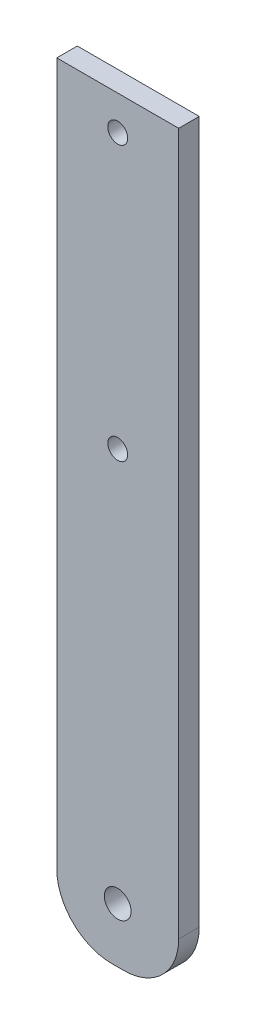
ISO-10303-21;
HEADER;
FILE_DESCRIPTION(('STEP AP214'),'2;1');
FILE_NAME('part.step','',(''),(''),'','','');
FILE_SCHEMA(('AUTOMOTIVE_DESIGN { 1 0 10303 214 1 1 1 1 }'));
ENDSEC;
DATA;
#1=APPLICATION_CONTEXT('core data for automotive mechanical design processes');
#2=APPLICATION_PROTOCOL_DEFINITION('international standard','automotive_design',2000,#1);
#3=PRODUCT_CONTEXT('',#1,'mechanical');
#4=PRODUCT('Part','Part','',(#3));
#5=PRODUCT_RELATED_PRODUCT_CATEGORY('part','',(#4));
#6=PRODUCT_DEFINITION_FORMATION('','',#4);
#7=PRODUCT_DEFINITION_CONTEXT('part definition',#1,'design');
#8=PRODUCT_DEFINITION('design','',#6,#7);
#9=PRODUCT_DEFINITION_SHAPE('','',#8);
#10=(LENGTH_UNIT() NAMED_UNIT(*) SI_UNIT(.MILLI.,.METRE.));
#11=(NAMED_UNIT(*) PLANE_ANGLE_UNIT() SI_UNIT($,.RADIAN.));
#12=(NAMED_UNIT(*) SI_UNIT($,.STERADIAN.) SOLID_ANGLE_UNIT());
#13=UNCERTAINTY_MEASURE_WITH_UNIT(LENGTH_MEASURE(1.E-05),#10,'distance_accuracy_value','');
#14=(GEOMETRIC_REPRESENTATION_CONTEXT(3) GLOBAL_UNCERTAINTY_ASSIGNED_CONTEXT((#13)) GLOBAL_UNIT_ASSIGNED_CONTEXT((#10,
#11,#12)) REPRESENTATION_CONTEXT('',''));
#15=CARTESIAN_POINT('',(0.,0.,0.));
#16=DIRECTION('',(0.,0.,1.));
#17=DIRECTION('',(1.,0.,0.));
#18=AXIS2_PLACEMENT_3D('',#15,#16,#17);
#19=CARTESIAN_POINT('',(0.,0.,3.));
#20=DIRECTION('',(0.,0.,-1.));
#21=DIRECTION('',(-1.,0.,0.));
#22=AXIS2_PLACEMENT_3D('',#19,#20,#21);
#23=PLANE('',#22);
#24=DIRECTION('',(1.,0.,0.));
#25=VECTOR('',#24,1.);
#26=CARTESIAN_POINT('',(-8.9,-8.,3.));
#27=LINE('',#26,#25);
#28=CARTESIAN_POINT('',(-0.9,-8.,3.));
#29=VERTEX_POINT('',#28);
#30=CARTESIAN_POINT('',(0.900000000000001,-8.,3.));
#31=VERTEX_POINT('',#30);
#32=EDGE_CURVE('E133',#29,#31,#27,.T.);
#33=ORIENTED_EDGE('',*,*,#32,.T.);
#34=CARTESIAN_POINT('',(0.900000000000001,0.,3.));
#35=DIRECTION('',(0.,0.,-1.));
#36=DIRECTION('',(-1.,0.,0.));
#37=AXIS2_PLACEMENT_3D('',#34,#35,#36);
#38=CIRCLE('',#37,8.);
#39=CARTESIAN_POINT('',(8.9,0.,3.));
#40=VERTEX_POINT('',#39);
#41=EDGE_CURVE('E54',#31,#40,#38,.F.);
#42=ORIENTED_EDGE('',*,*,#41,.T.);
#43=DIRECTION('',(0.,1.,0.));
#44=VECTOR('',#43,1.);
#45=CARTESIAN_POINT('',(8.9,-8.,3.));
#46=LINE('',#45,#44);
#47=CARTESIAN_POINT('',(8.9,102.5,3.));
#48=VERTEX_POINT('',#47);
#49=EDGE_CURVE('E100',#40,#48,#46,.T.);
#50=ORIENTED_EDGE('',*,*,#49,.T.);
#51=DIRECTION('',(-1.,0.,0.));
#52=VECTOR('',#51,1.);
#53=CARTESIAN_POINT('',(-8.9,102.5,3.));
#54=LINE('',#53,#52);
#55=CARTESIAN_POINT('',(-8.9,102.5,3.));
#56=VERTEX_POINT('',#55);
#57=EDGE_CURVE('E103',#48,#56,#54,.T.);
#58=ORIENTED_EDGE('',*,*,#57,.T.);
#59=DIRECTION('',(0.,-1.,0.));
#60=VECTOR('',#59,1.);
#61=CARTESIAN_POINT('',(-8.9,-8.,3.));
#62=LINE('',#61,#60);
#63=CARTESIAN_POINT('',(-8.9,0.,3.));
#64=VERTEX_POINT('',#63);
#65=EDGE_CURVE('E120',#56,#64,#62,.T.);
#66=ORIENTED_EDGE('',*,*,#65,.T.);
#67=CARTESIAN_POINT('',(-0.9,0.,3.));
#68=DIRECTION('',(0.,0.,-1.));
#69=DIRECTION('',(-1.,0.,0.));
#70=AXIS2_PLACEMENT_3D('',#67,#68,#69);
#71=CIRCLE('',#70,8.);
#72=EDGE_CURVE('E148',#64,#29,#71,.F.);
#73=ORIENTED_EDGE('',*,*,#72,.T.);
#74=EDGE_LOOP('',(#33,#42,#50,#58,#66,#73));
#75=FACE_BOUND('',#74,.T.);
#76=CARTESIAN_POINT('',(0.,0.,3.));
#77=DIRECTION('',(0.,0.,1.));
#78=DIRECTION('',(1.,0.,0.));
#79=AXIS2_PLACEMENT_3D('',#76,#77,#78);
#80=CIRCLE('',#79,1.95);
#81=CARTESIAN_POINT('',(1.95,0.,3.));
#82=VERTEX_POINT('',#81);
#83=EDGE_CURVE('E172',#82,#82,#80,.T.);
#84=ORIENTED_EDGE('',*,*,#83,.F.);
#85=EDGE_LOOP('',(#84));
#86=FACE_BOUND('',#85,.T.);
#87=CARTESIAN_POINT('',(0.,57.5,3.));
#88=DIRECTION('',(0.,0.,1.));
#89=DIRECTION('',(1.,0.,0.));
#90=AXIS2_PLACEMENT_3D('',#87,#88,#89);
#91=CIRCLE('',#90,1.45);
#92=CARTESIAN_POINT('',(1.45,57.5,3.));
#93=VERTEX_POINT('',#92);
#94=EDGE_CURVE('E180',#93,#93,#91,.T.);
#95=ORIENTED_EDGE('',*,*,#94,.F.);
#96=EDGE_LOOP('',(#95));
#97=FACE_BOUND('',#96,.T.);
#98=CARTESIAN_POINT('',(0.,97.5,3.));
#99=DIRECTION('',(0.,0.,1.));
#100=DIRECTION('',(1.,0.,0.));
#101=AXIS2_PLACEMENT_3D('',#98,#99,#100);
#102=CIRCLE('',#101,1.45);
#103=CARTESIAN_POINT('',(1.45,97.5,3.));
#104=VERTEX_POINT('',#103);
#105=EDGE_CURVE('E188',#104,#104,#102,.T.);
#106=ORIENTED_EDGE('',*,*,#105,.F.);
#107=EDGE_LOOP('',(#106));
#108=FACE_BOUND('',#107,.T.);
#109=ADVANCED_FACE('F45',(#75,#86,#97,#108),#23,.F.);
#110=CARTESIAN_POINT('',(0.,0.,0.));
#111=DIRECTION('',(0.,0.,-1.));
#112=DIRECTION('',(-1.,0.,0.));
#113=AXIS2_PLACEMENT_3D('',#110,#111,#112);
#114=PLANE('',#113);
#115=CARTESIAN_POINT('',(0.,57.5,0.));
#116=DIRECTION('',(0.,0.,1.));
#117=DIRECTION('',(1.,0.,0.));
#118=AXIS2_PLACEMENT_3D('',#115,#116,#117);
#119=CIRCLE('',#118,1.45);
#120=CARTESIAN_POINT('',(1.45,57.5,0.));
#121=VERTEX_POINT('',#120);
#122=EDGE_CURVE('E184',#121,#121,#119,.T.);
#123=ORIENTED_EDGE('',*,*,#122,.T.);
#124=EDGE_LOOP('',(#123));
#125=FACE_BOUND('',#124,.T.);
#126=DIRECTION('',(0.,1.,0.));
#127=VECTOR('',#126,1.);
#128=CARTESIAN_POINT('',(8.9,-8.,0.));
#129=LINE('',#128,#127);
#130=CARTESIAN_POINT('',(8.9,0.,0.));
#131=VERTEX_POINT('',#130);
#132=CARTESIAN_POINT('',(8.9,102.5,0.));
#133=VERTEX_POINT('',#132);
#134=EDGE_CURVE('E124',#131,#133,#129,.T.);
#135=ORIENTED_EDGE('',*,*,#134,.F.);
#136=CARTESIAN_POINT('',(0.900000000000001,0.,0.));
#137=DIRECTION('',(0.,0.,-1.));
#138=DIRECTION('',(-1.,0.,0.));
#139=AXIS2_PLACEMENT_3D('',#136,#137,#138);
#140=CIRCLE('',#139,8.);
#141=CARTESIAN_POINT('',(0.900000000000001,-8.,0.));
#142=VERTEX_POINT('',#141);
#143=EDGE_CURVE('E139',#131,#142,#140,.T.);
#144=ORIENTED_EDGE('',*,*,#143,.T.);
#145=DIRECTION('',(1.,0.,0.));
#146=VECTOR('',#145,1.);
#147=CARTESIAN_POINT('',(-8.9,-8.,0.));
#148=LINE('',#147,#146);
#149=CARTESIAN_POINT('',(-0.9,-8.,0.));
#150=VERTEX_POINT('',#149);
#151=EDGE_CURVE('E111',#150,#142,#148,.T.);
#152=ORIENTED_EDGE('',*,*,#151,.F.);
#153=CARTESIAN_POINT('',(-0.9,0.,0.));
#154=DIRECTION('',(0.,0.,-1.));
#155=DIRECTION('',(-1.,0.,0.));
#156=AXIS2_PLACEMENT_3D('',#153,#154,#155);
#157=CIRCLE('',#156,8.);
#158=CARTESIAN_POINT('',(-8.9,0.,0.));
#159=VERTEX_POINT('',#158);
#160=EDGE_CURVE('E131',#150,#159,#157,.T.);
#161=ORIENTED_EDGE('',*,*,#160,.T.);
#162=DIRECTION('',(0.,-1.,0.));
#163=VECTOR('',#162,1.);
#164=CARTESIAN_POINT('',(-8.9,-8.,0.));
#165=LINE('',#164,#163);
#166=CARTESIAN_POINT('',(-8.9,102.5,0.));
#167=VERTEX_POINT('',#166);
#168=EDGE_CURVE('E162',#167,#159,#165,.T.);
#169=ORIENTED_EDGE('',*,*,#168,.F.);
#170=DIRECTION('',(-1.,0.,0.));
#171=VECTOR('',#170,1.);
#172=CARTESIAN_POINT('',(-8.9,102.5,0.));
#173=LINE('',#172,#171);
#174=EDGE_CURVE('E165',#133,#167,#173,.T.);
#175=ORIENTED_EDGE('',*,*,#174,.F.);
#176=EDGE_LOOP('',(#135,#144,#152,#161,#169,#175));
#177=FACE_BOUND('',#176,.T.);
#178=CARTESIAN_POINT('',(0.,0.,0.));
#179=DIRECTION('',(0.,0.,1.));
#180=DIRECTION('',(1.,0.,0.));
#181=AXIS2_PLACEMENT_3D('',#178,#179,#180);
#182=CIRCLE('',#181,1.95);
#183=CARTESIAN_POINT('',(1.95,0.,0.));
#184=VERTEX_POINT('',#183);
#185=EDGE_CURVE('E176',#184,#184,#182,.T.);
#186=ORIENTED_EDGE('',*,*,#185,.T.);
#187=EDGE_LOOP('',(#186));
#188=FACE_BOUND('',#187,.T.);
#189=CARTESIAN_POINT('',(0.,97.5,0.));
#190=DIRECTION('',(0.,0.,1.));
#191=DIRECTION('',(1.,0.,0.));
#192=AXIS2_PLACEMENT_3D('',#189,#190,#191);
#193=CIRCLE('',#192,1.45);
#194=CARTESIAN_POINT('',(1.45,97.5,0.));
#195=VERTEX_POINT('',#194);
#196=EDGE_CURVE('E192',#195,#195,#193,.T.);
#197=ORIENTED_EDGE('',*,*,#196,.T.);
#198=EDGE_LOOP('',(#197));
#199=FACE_BOUND('',#198,.T.);
#200=ADVANCED_FACE('F160',(#125,#177,#188,#199),#114,.T.);
#201=CARTESIAN_POINT('',(8.9,-8.,3.));
#202=DIRECTION('',(-1.,0.,0.));
#203=DIRECTION('',(0.,-1.,0.));
#204=AXIS2_PLACEMENT_3D('',#201,#202,#203);
#205=PLANE('',#204);
#206=ORIENTED_EDGE('',*,*,#49,.F.);
#207=DIRECTION('',(0.,0.,-1.));
#208=VECTOR('',#207,1.);
#209=CARTESIAN_POINT('',(8.9,0.,3.));
#210=LINE('',#209,#208);
#211=EDGE_CURVE('E127',#40,#131,#210,.T.);
#212=ORIENTED_EDGE('',*,*,#211,.T.);
#213=ORIENTED_EDGE('',*,*,#134,.T.);
#214=DIRECTION('',(0.,0.,-1.));
#215=VECTOR('',#214,1.);
#216=CARTESIAN_POINT('',(8.9,102.5,3.));
#217=LINE('',#216,#215);
#218=EDGE_CURVE('E116',#48,#133,#217,.T.);
#219=ORIENTED_EDGE('',*,*,#218,.F.);
#220=EDGE_LOOP('',(#206,#212,#213,#219));
#221=FACE_BOUND('',#220,.T.);
#222=ADVANCED_FACE('F122',(#221),#205,.F.);
#223=CARTESIAN_POINT('',(-8.9,102.5,3.));
#224=DIRECTION('',(0.,-1.,0.));
#225=DIRECTION('',(0.,0.,-1.));
#226=AXIS2_PLACEMENT_3D('',#223,#224,#225);
#227=PLANE('',#226);
#228=ORIENTED_EDGE('',*,*,#174,.T.);
#229=DIRECTION('',(0.,0.,-1.));
#230=VECTOR('',#229,1.);
#231=CARTESIAN_POINT('',(-8.9,102.5,3.));
#232=LINE('',#231,#230);
#233=EDGE_CURVE('E118',#56,#167,#232,.T.);
#234=ORIENTED_EDGE('',*,*,#233,.F.);
#235=ORIENTED_EDGE('',*,*,#57,.F.);
#236=ORIENTED_EDGE('',*,*,#218,.T.);
#237=EDGE_LOOP('',(#228,#234,#235,#236));
#238=FACE_BOUND('',#237,.T.);
#239=ADVANCED_FACE('F115',(#238),#227,.F.);
#240=CARTESIAN_POINT('',(-8.9,-8.,3.));
#241=DIRECTION('',(1.,0.,0.));
#242=DIRECTION('',(0.,1.,0.));
#243=AXIS2_PLACEMENT_3D('',#240,#241,#242);
#244=PLANE('',#243);
#245=ORIENTED_EDGE('',*,*,#168,.T.);
#246=DIRECTION('',(0.,0.,-1.));
#247=VECTOR('',#246,1.);
#248=CARTESIAN_POINT('',(-8.9,0.,3.));
#249=LINE('',#248,#247);
#250=EDGE_CURVE('E11',#159,#64,#249,.F.);
#251=ORIENTED_EDGE('',*,*,#250,.T.);
#252=ORIENTED_EDGE('',*,*,#65,.F.);
#253=ORIENTED_EDGE('',*,*,#233,.T.);
#254=EDGE_LOOP('',(#245,#251,#252,#253));
#255=FACE_BOUND('',#254,.T.);
#256=ADVANCED_FACE('F163',(#255),#244,.F.);
#257=CARTESIAN_POINT('',(-8.9,-8.,3.));
#258=DIRECTION('',(0.,1.,0.));
#259=DIRECTION('',(0.,0.,1.));
#260=AXIS2_PLACEMENT_3D('',#257,#258,#259);
#261=PLANE('',#260);
#262=ORIENTED_EDGE('',*,*,#151,.T.);
#263=DIRECTION('',(0.,0.,-1.));
#264=VECTOR('',#263,1.);
#265=CARTESIAN_POINT('',(0.900000000000001,-8.,3.));
#266=LINE('',#265,#264);
#267=EDGE_CURVE('E67',#142,#31,#266,.F.);
#268=ORIENTED_EDGE('',*,*,#267,.T.);
#269=ORIENTED_EDGE('',*,*,#32,.F.);
#270=DIRECTION('',(0.,0.,-1.));
#271=VECTOR('',#270,1.);
#272=CARTESIAN_POINT('',(-0.9,-8.,3.));
#273=LINE('',#272,#271);
#274=EDGE_CURVE('E142',#29,#150,#273,.T.);
#275=ORIENTED_EDGE('',*,*,#274,.T.);
#276=EDGE_LOOP('',(#262,#268,#269,#275));
#277=FACE_BOUND('',#276,.T.);
#278=ADVANCED_FACE('F154',(#277),#261,.F.);
#279=CARTESIAN_POINT('',(0.,0.,3.));
#280=DIRECTION('',(0.,0.,-1.));
#281=DIRECTION('',(-1.,0.,0.));
#282=AXIS2_PLACEMENT_3D('',#279,#280,#281);
#283=CYLINDRICAL_SURFACE('',#282,1.95);
#284=ORIENTED_EDGE('',*,*,#83,.T.);
#285=EDGE_LOOP('',(#284));
#286=FACE_BOUND('',#285,.T.);
#287=ORIENTED_EDGE('',*,*,#185,.F.);
#288=EDGE_LOOP('',(#287));
#289=FACE_BOUND('',#288,.T.);
#290=ADVANCED_FACE('F212',(#286,#289),#283,.F.);
#291=CARTESIAN_POINT('',(0.,57.5,3.));
#292=DIRECTION('',(0.,0.,-1.));
#293=DIRECTION('',(-1.,0.,0.));
#294=AXIS2_PLACEMENT_3D('',#291,#292,#293);
#295=CYLINDRICAL_SURFACE('',#294,1.45);
#296=ORIENTED_EDGE('',*,*,#94,.T.);
#297=EDGE_LOOP('',(#296));
#298=FACE_BOUND('',#297,.T.);
#299=ORIENTED_EDGE('',*,*,#122,.F.);
#300=EDGE_LOOP('',(#299));
#301=FACE_BOUND('',#300,.T.);
#302=ADVANCED_FACE('F228',(#298,#301),#295,.F.);
#303=CARTESIAN_POINT('',(0.,97.5,3.));
#304=DIRECTION('',(0.,0.,-1.));
#305=DIRECTION('',(-1.,0.,0.));
#306=AXIS2_PLACEMENT_3D('',#303,#304,#305);
#307=CYLINDRICAL_SURFACE('',#306,1.45);
#308=ORIENTED_EDGE('',*,*,#105,.T.);
#309=EDGE_LOOP('',(#308));
#310=FACE_BOUND('',#309,.T.);
#311=ORIENTED_EDGE('',*,*,#196,.F.);
#312=EDGE_LOOP('',(#311));
#313=FACE_BOUND('',#312,.T.);
#314=ADVANCED_FACE('F200',(#310,#313),#307,.F.);
#315=CARTESIAN_POINT('',(0.900000000000001,0.,3.));
#316=DIRECTION('',(0.,0.,-1.));
#317=DIRECTION('',(-1.,0.,0.));
#318=AXIS2_PLACEMENT_3D('',#315,#316,#317);
#319=CYLINDRICAL_SURFACE('',#318,8.);
#320=ORIENTED_EDGE('',*,*,#41,.F.);
#321=ORIENTED_EDGE('',*,*,#267,.F.);
#322=ORIENTED_EDGE('',*,*,#143,.F.);
#323=ORIENTED_EDGE('',*,*,#211,.F.);
#324=EDGE_LOOP('',(#320,#321,#322,#323));
#325=FACE_BOUND('',#324,.T.);
#326=ADVANCED_FACE('F222',(#325),#319,.T.);
#327=CARTESIAN_POINT('',(-0.9,0.,3.));
#328=DIRECTION('',(0.,0.,-1.));
#329=DIRECTION('',(-1.,0.,0.));
#330=AXIS2_PLACEMENT_3D('',#327,#328,#329);
#331=CYLINDRICAL_SURFACE('',#330,8.);
#332=ORIENTED_EDGE('',*,*,#72,.F.);
#333=ORIENTED_EDGE('',*,*,#250,.F.);
#334=ORIENTED_EDGE('',*,*,#160,.F.);
#335=ORIENTED_EDGE('',*,*,#274,.F.);
#336=EDGE_LOOP('',(#332,#333,#334,#335));
#337=FACE_BOUND('',#336,.T.);
#338=ADVANCED_FACE('F47',(#337),#331,.T.);
#339=CLOSED_SHELL('',(#109,#200,#222,#239,#256,#278,#290,#302,#314,#326,#338));
#340=MANIFOLD_SOLID_BREP('B2',#339);
#341=ADVANCED_BREP_SHAPE_REPRESENTATION('',(#18,#340),#14);
#342=SHAPE_DEFINITION_REPRESENTATION(#9,#341);
ENDSEC;
END-ISO-10303-21;
